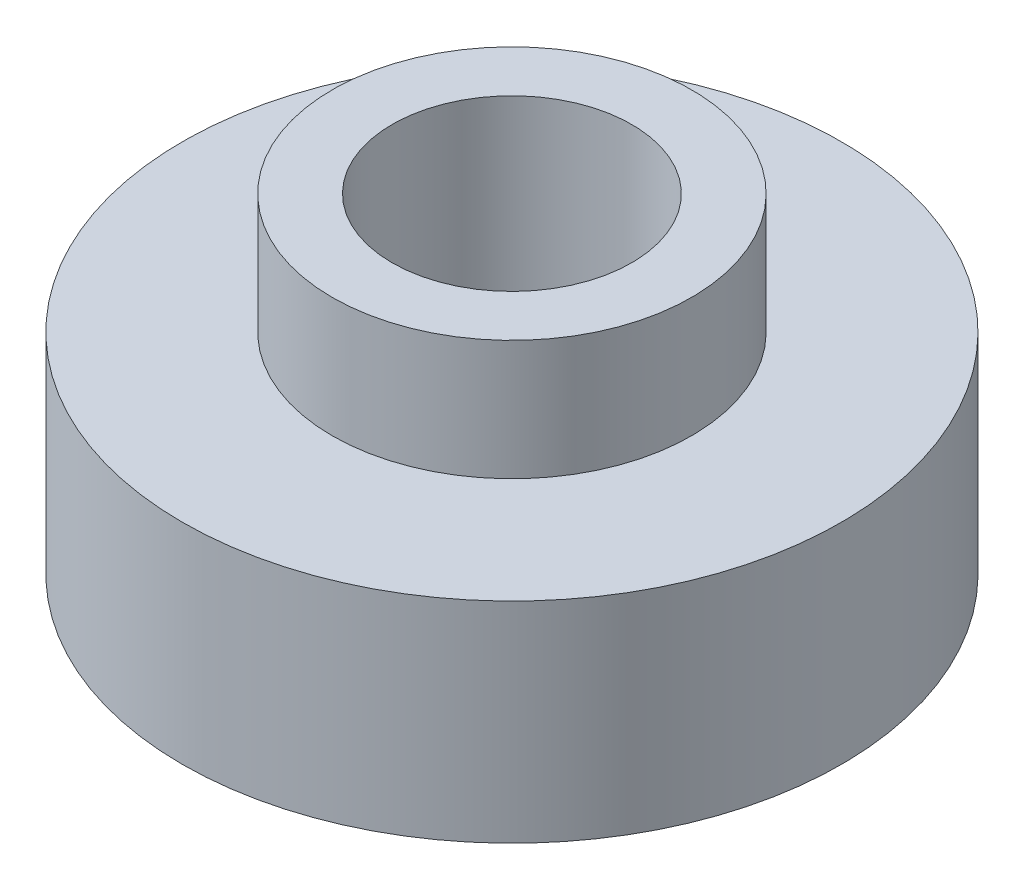
ISO-10303-21;
HEADER;
FILE_DESCRIPTION(('STEP AP214'),'2;1');
FILE_NAME('part.step','',(''),(''),'','','');
FILE_SCHEMA(('AUTOMOTIVE_DESIGN { 1 0 10303 214 1 1 1 1 }'));
ENDSEC;
DATA;
#1=APPLICATION_CONTEXT('core data for automotive mechanical design processes');
#2=APPLICATION_PROTOCOL_DEFINITION('international standard','automotive_design',2000,#1);
#3=PRODUCT_CONTEXT('',#1,'mechanical');
#4=PRODUCT('Part','Part','',(#3));
#5=PRODUCT_RELATED_PRODUCT_CATEGORY('part','',(#4));
#6=PRODUCT_DEFINITION_FORMATION('','',#4);
#7=PRODUCT_DEFINITION_CONTEXT('part definition',#1,'design');
#8=PRODUCT_DEFINITION('design','',#6,#7);
#9=PRODUCT_DEFINITION_SHAPE('','',#8);
#10=(LENGTH_UNIT() NAMED_UNIT(*) SI_UNIT(.MILLI.,.METRE.));
#11=(NAMED_UNIT(*) PLANE_ANGLE_UNIT() SI_UNIT($,.RADIAN.));
#12=(NAMED_UNIT(*) SI_UNIT($,.STERADIAN.) SOLID_ANGLE_UNIT());
#13=UNCERTAINTY_MEASURE_WITH_UNIT(LENGTH_MEASURE(1.E-05),#10,'distance_accuracy_value','');
#14=(GEOMETRIC_REPRESENTATION_CONTEXT(3) GLOBAL_UNCERTAINTY_ASSIGNED_CONTEXT((#13)) GLOBAL_UNIT_ASSIGNED_CONTEXT((#10,
#11,#12)) REPRESENTATION_CONTEXT('',''));
#15=CARTESIAN_POINT('',(0.,0.,0.));
#16=DIRECTION('',(0.,0.,1.));
#17=DIRECTION('',(1.,0.,0.));
#18=AXIS2_PLACEMENT_3D('',#15,#16,#17);
#19=CARTESIAN_POINT('',(0.,7.,0.));
#20=DIRECTION('',(0.,-1.,0.));
#21=DIRECTION('',(0.,0.,-1.));
#22=AXIS2_PLACEMENT_3D('',#19,#20,#21);
#23=CYLINDRICAL_SURFACE('',#22,11.);
#24=CARTESIAN_POINT('',(0.,7.,0.));
#25=DIRECTION('',(0.,1.,0.));
#26=DIRECTION('',(0.,0.,1.));
#27=AXIS2_PLACEMENT_3D('',#24,#25,#26);
#28=CIRCLE('',#27,11.);
#29=CARTESIAN_POINT('',(0.,7.,11.));
#30=VERTEX_POINT('',#29);
#31=EDGE_CURVE('E38',#30,#30,#28,.T.);
#32=ORIENTED_EDGE('',*,*,#31,.F.);
#33=EDGE_LOOP('',(#32));
#34=FACE_BOUND('',#33,.T.);
#35=CARTESIAN_POINT('',(0.,0.,0.));
#36=DIRECTION('',(0.,1.,0.));
#37=DIRECTION('',(0.,0.,1.));
#38=AXIS2_PLACEMENT_3D('',#35,#36,#37);
#39=CIRCLE('',#38,11.);
#40=CARTESIAN_POINT('',(0.,0.,11.));
#41=VERTEX_POINT('',#40);
#42=EDGE_CURVE('E34',#41,#41,#39,.T.);
#43=ORIENTED_EDGE('',*,*,#42,.T.);
#44=EDGE_LOOP('',(#43));
#45=FACE_BOUND('',#44,.T.);
#46=ADVANCED_FACE('F31',(#34,#45),#23,.T.);
#47=CARTESIAN_POINT('',(0.,7.,0.));
#48=DIRECTION('',(0.,1.,0.));
#49=DIRECTION('',(0.,0.,1.));
#50=AXIS2_PLACEMENT_3D('',#47,#48,#49);
#51=PLANE('',#50);
#52=CARTESIAN_POINT('',(0.,7.,0.));
#53=DIRECTION('',(0.,1.,0.));
#54=DIRECTION('',(0.,0.,1.));
#55=AXIS2_PLACEMENT_3D('',#52,#53,#54);
#56=CIRCLE('',#55,6.);
#57=CARTESIAN_POINT('',(0.,7.,6.));
#58=VERTEX_POINT('',#57);
#59=EDGE_CURVE('E10',#58,#58,#56,.T.);
#60=ORIENTED_EDGE('',*,*,#59,.F.);
#61=EDGE_LOOP('',(#60));
#62=FACE_BOUND('',#61,.T.);
#63=ORIENTED_EDGE('',*,*,#31,.T.);
#64=EDGE_LOOP('',(#63));
#65=FACE_BOUND('',#64,.T.);
#66=ADVANCED_FACE('F70',(#62,#65),#51,.T.);
#67=CARTESIAN_POINT('',(0.,0.,0.));
#68=DIRECTION('',(0.,1.,0.));
#69=DIRECTION('',(0.,0.,1.));
#70=AXIS2_PLACEMENT_3D('',#67,#68,#69);
#71=PLANE('',#70);
#72=CARTESIAN_POINT('',(0.,0.,0.));
#73=DIRECTION('',(0.,1.,0.));
#74=DIRECTION('',(0.,0.,1.));
#75=AXIS2_PLACEMENT_3D('',#72,#73,#74);
#76=CIRCLE('',#75,4.);
#77=CARTESIAN_POINT('',(0.,0.,4.));
#78=VERTEX_POINT('',#77);
#79=EDGE_CURVE('E47',#78,#78,#76,.F.);
#80=ORIENTED_EDGE('',*,*,#79,.F.);
#81=EDGE_LOOP('',(#80));
#82=FACE_BOUND('',#81,.T.);
#83=ORIENTED_EDGE('',*,*,#42,.F.);
#84=EDGE_LOOP('',(#83));
#85=FACE_BOUND('',#84,.T.);
#86=ADVANCED_FACE('F65',(#82,#85),#71,.F.);
#87=CARTESIAN_POINT('',(0.,11.,0.));
#88=DIRECTION('',(0.,-1.,0.));
#89=DIRECTION('',(0.,0.,-1.));
#90=AXIS2_PLACEMENT_3D('',#87,#88,#89);
#91=CYLINDRICAL_SURFACE('',#90,6.);
#92=CARTESIAN_POINT('',(0.,11.,0.));
#93=DIRECTION('',(0.,1.,0.));
#94=DIRECTION('',(0.,0.,1.));
#95=AXIS2_PLACEMENT_3D('',#92,#93,#94);
#96=CIRCLE('',#95,6.);
#97=CARTESIAN_POINT('',(0.,11.,6.));
#98=VERTEX_POINT('',#97);
#99=EDGE_CURVE('E44',#98,#98,#96,.T.);
#100=ORIENTED_EDGE('',*,*,#99,.F.);
#101=EDGE_LOOP('',(#100));
#102=FACE_BOUND('',#101,.T.);
#103=ORIENTED_EDGE('',*,*,#59,.T.);
#104=EDGE_LOOP('',(#103));
#105=FACE_BOUND('',#104,.T.);
#106=ADVANCED_FACE('F60',(#102,#105),#91,.T.);
#107=CARTESIAN_POINT('',(0.,11.,0.));
#108=DIRECTION('',(0.,1.,0.));
#109=DIRECTION('',(0.,0.,1.));
#110=AXIS2_PLACEMENT_3D('',#107,#108,#109);
#111=PLANE('',#110);
#112=CARTESIAN_POINT('',(0.,11.,0.));
#113=DIRECTION('',(0.,1.,0.));
#114=DIRECTION('',(0.,0.,1.));
#115=AXIS2_PLACEMENT_3D('',#112,#113,#114);
#116=CIRCLE('',#115,4.);
#117=CARTESIAN_POINT('',(0.,11.,4.));
#118=VERTEX_POINT('',#117);
#119=EDGE_CURVE('E50',#118,#118,#116,.T.);
#120=ORIENTED_EDGE('',*,*,#119,.F.);
#121=EDGE_LOOP('',(#120));
#122=FACE_BOUND('',#121,.T.);
#123=ORIENTED_EDGE('',*,*,#99,.T.);
#124=EDGE_LOOP('',(#123));
#125=FACE_BOUND('',#124,.T.);
#126=ADVANCED_FACE('F57',(#122,#125),#111,.T.);
#127=CARTESIAN_POINT('',(0.,-0.000999999999999265,0.));
#128=DIRECTION('',(0.,1.,0.));
#129=DIRECTION('',(0.,0.,1.));
#130=AXIS2_PLACEMENT_3D('',#127,#128,#129);
#131=CYLINDRICAL_SURFACE('',#130,4.);
#132=ORIENTED_EDGE('',*,*,#119,.T.);
#133=EDGE_LOOP('',(#132));
#134=FACE_BOUND('',#133,.T.);
#135=ORIENTED_EDGE('',*,*,#79,.T.);
#136=EDGE_LOOP('',(#135));
#137=FACE_BOUND('',#136,.T.);
#138=ADVANCED_FACE('F54',(#134,#137),#131,.F.);
#139=CLOSED_SHELL('',(#46,#66,#86,#106,#126,#138));
#140=MANIFOLD_SOLID_BREP('B2',#139);
#141=ADVANCED_BREP_SHAPE_REPRESENTATION('',(#18,#140),#14);
#142=SHAPE_DEFINITION_REPRESENTATION(#9,#141);
ENDSEC;
END-ISO-10303-21;
